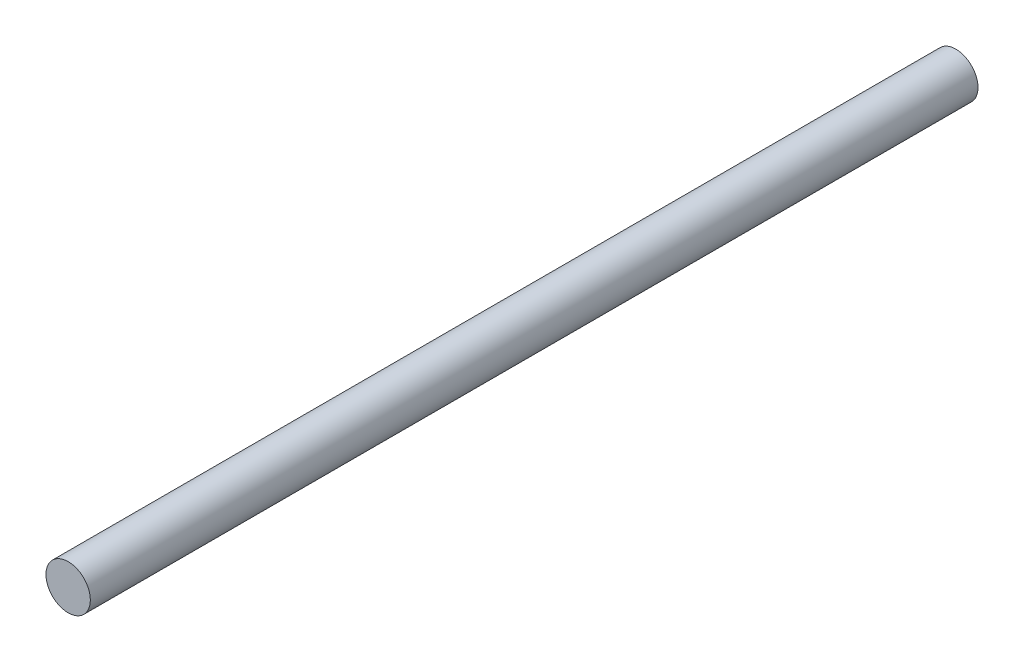
ISO-10303-21;
HEADER;
FILE_DESCRIPTION(('STEP AP214'),'2;1');
FILE_NAME('part.step','',(''),(''),'','','');
FILE_SCHEMA(('AUTOMOTIVE_DESIGN { 1 0 10303 214 1 1 1 1 }'));
ENDSEC;
DATA;
#1=APPLICATION_CONTEXT('core data for automotive mechanical design processes');
#2=APPLICATION_PROTOCOL_DEFINITION('international standard','automotive_design',2000,#1);
#3=PRODUCT_CONTEXT('',#1,'mechanical');
#4=PRODUCT('Part','Part','',(#3));
#5=PRODUCT_RELATED_PRODUCT_CATEGORY('part','',(#4));
#6=PRODUCT_DEFINITION_FORMATION('','',#4);
#7=PRODUCT_DEFINITION_CONTEXT('part definition',#1,'design');
#8=PRODUCT_DEFINITION('design','',#6,#7);
#9=PRODUCT_DEFINITION_SHAPE('','',#8);
#10=(LENGTH_UNIT() NAMED_UNIT(*) SI_UNIT(.MILLI.,.METRE.));
#11=(NAMED_UNIT(*) PLANE_ANGLE_UNIT() SI_UNIT($,.RADIAN.));
#12=(NAMED_UNIT(*) SI_UNIT($,.STERADIAN.) SOLID_ANGLE_UNIT());
#13=UNCERTAINTY_MEASURE_WITH_UNIT(LENGTH_MEASURE(1.E-05),#10,'distance_accuracy_value','');
#14=(GEOMETRIC_REPRESENTATION_CONTEXT(3) GLOBAL_UNCERTAINTY_ASSIGNED_CONTEXT((#13)) GLOBAL_UNIT_ASSIGNED_CONTEXT((#10,
#11,#12)) REPRESENTATION_CONTEXT('',''));
#15=CARTESIAN_POINT('',(0.,0.,0.));
#16=DIRECTION('',(0.,0.,1.));
#17=DIRECTION('',(1.,0.,0.));
#18=AXIS2_PLACEMENT_3D('',#15,#16,#17);
#19=CARTESIAN_POINT('',(0.,0.,-100.));
#20=DIRECTION('',(0.,0.,1.));
#21=DIRECTION('',(1.,0.,0.));
#22=AXIS2_PLACEMENT_3D('',#19,#20,#21);
#23=CYLINDRICAL_SURFACE('',#22,2.5);
#24=CARTESIAN_POINT('',(0.,0.,-100.));
#25=DIRECTION('',(0.,0.,1.));
#26=DIRECTION('',(1.,0.,0.));
#27=AXIS2_PLACEMENT_3D('',#24,#25,#26);
#28=CIRCLE('',#27,2.5);
#29=CARTESIAN_POINT('',(2.5,0.,-100.));
#30=VERTEX_POINT('',#29);
#31=EDGE_CURVE('E10',#30,#30,#28,.T.);
#32=ORIENTED_EDGE('',*,*,#31,.T.);
#33=EDGE_LOOP('',(#32));
#34=FACE_BOUND('',#33,.T.);
#35=CARTESIAN_POINT('',(0.,0.,0.));
#36=DIRECTION('',(0.,0.,1.));
#37=DIRECTION('',(1.,0.,0.));
#38=AXIS2_PLACEMENT_3D('',#35,#36,#37);
#39=CIRCLE('',#38,2.5);
#40=CARTESIAN_POINT('',(2.5,0.,0.));
#41=VERTEX_POINT('',#40);
#42=EDGE_CURVE('E33',#41,#41,#39,.T.);
#43=ORIENTED_EDGE('',*,*,#42,.F.);
#44=EDGE_LOOP('',(#43));
#45=FACE_BOUND('',#44,.T.);
#46=ADVANCED_FACE('F30',(#34,#45),#23,.T.);
#47=CARTESIAN_POINT('',(0.,0.,-100.));
#48=DIRECTION('',(0.,0.,1.));
#49=DIRECTION('',(1.,0.,0.));
#50=AXIS2_PLACEMENT_3D('',#47,#48,#49);
#51=PLANE('',#50);
#52=ORIENTED_EDGE('',*,*,#31,.F.);
#53=EDGE_LOOP('',(#52));
#54=FACE_BOUND('',#53,.T.);
#55=ADVANCED_FACE('F45',(#54),#51,.F.);
#56=CARTESIAN_POINT('',(0.,0.,0.));
#57=DIRECTION('',(0.,0.,1.));
#58=DIRECTION('',(1.,0.,0.));
#59=AXIS2_PLACEMENT_3D('',#56,#57,#58);
#60=PLANE('',#59);
#61=ORIENTED_EDGE('',*,*,#42,.T.);
#62=EDGE_LOOP('',(#61));
#63=FACE_BOUND('',#62,.T.);
#64=ADVANCED_FACE('F42',(#63),#60,.T.);
#65=CLOSED_SHELL('',(#46,#55,#64));
#66=MANIFOLD_SOLID_BREP('B2',#65);
#67=ADVANCED_BREP_SHAPE_REPRESENTATION('',(#18,#66),#14);
#68=SHAPE_DEFINITION_REPRESENTATION(#9,#67);
ENDSEC;
END-ISO-10303-21;
